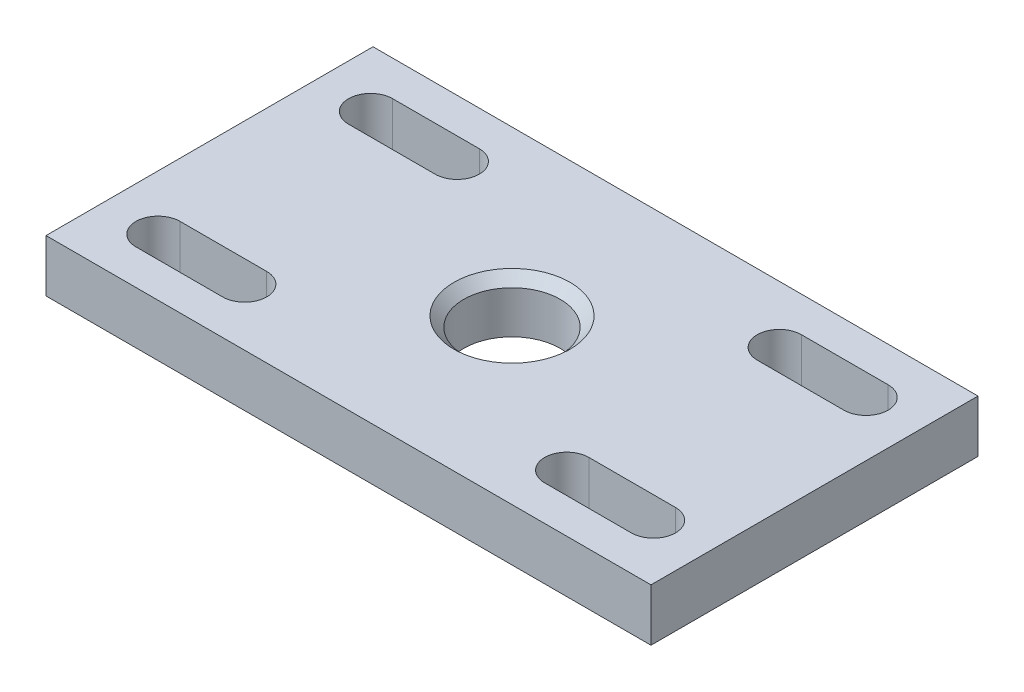
ISO-10303-21;
HEADER;
FILE_DESCRIPTION(('STEP AP214'),'2;1');
FILE_NAME('part.step','',(''),(''),'','','');
FILE_SCHEMA(('AUTOMOTIVE_DESIGN { 1 0 10303 214 1 1 1 1 }'));
ENDSEC;
DATA;
#1=APPLICATION_CONTEXT('core data for automotive mechanical design processes');
#2=APPLICATION_PROTOCOL_DEFINITION('international standard','automotive_design',2000,#1);
#3=PRODUCT_CONTEXT('',#1,'mechanical');
#4=PRODUCT('Part','Part','',(#3));
#5=PRODUCT_RELATED_PRODUCT_CATEGORY('part','',(#4));
#6=PRODUCT_DEFINITION_FORMATION('','',#4);
#7=PRODUCT_DEFINITION_CONTEXT('part definition',#1,'design');
#8=PRODUCT_DEFINITION('design','',#6,#7);
#9=PRODUCT_DEFINITION_SHAPE('','',#8);
#10=(LENGTH_UNIT() NAMED_UNIT(*) SI_UNIT(.MILLI.,.METRE.));
#11=(NAMED_UNIT(*) PLANE_ANGLE_UNIT() SI_UNIT($,.RADIAN.));
#12=(NAMED_UNIT(*) SI_UNIT($,.STERADIAN.) SOLID_ANGLE_UNIT());
#13=UNCERTAINTY_MEASURE_WITH_UNIT(LENGTH_MEASURE(1.E-05),#10,'distance_accuracy_value','');
#14=(GEOMETRIC_REPRESENTATION_CONTEXT(3) GLOBAL_UNCERTAINTY_ASSIGNED_CONTEXT((#13)) GLOBAL_UNIT_ASSIGNED_CONTEXT((#10,
#11,#12)) REPRESENTATION_CONTEXT('',''));
#15=CARTESIAN_POINT('',(0.,0.,0.));
#16=DIRECTION('',(0.,0.,1.));
#17=DIRECTION('',(1.,0.,0.));
#18=AXIS2_PLACEMENT_3D('',#15,#16,#17);
#19=CARTESIAN_POINT('',(92.5,16.,50.));
#20=DIRECTION('',(-1.,0.,0.));
#21=DIRECTION('',(0.,0.,1.));
#22=AXIS2_PLACEMENT_3D('',#19,#20,#21);
#23=PLANE('',#22);
#24=DIRECTION('',(0.,0.,-1.));
#25=VECTOR('',#24,1.);
#26=CARTESIAN_POINT('',(92.5,0.,50.));
#27=LINE('',#26,#25);
#28=CARTESIAN_POINT('',(92.5,0.,50.));
#29=VERTEX_POINT('',#28);
#30=CARTESIAN_POINT('',(92.5,0.,-50.));
#31=VERTEX_POINT('',#30);
#32=EDGE_CURVE('E195',#29,#31,#27,.T.);
#33=ORIENTED_EDGE('',*,*,#32,.T.);
#34=DIRECTION('',(0.,-1.,0.));
#35=VECTOR('',#34,1.);
#36=CARTESIAN_POINT('',(92.5,16.,-50.));
#37=LINE('',#36,#35);
#38=CARTESIAN_POINT('',(92.5,16.,-50.));
#39=VERTEX_POINT('',#38);
#40=EDGE_CURVE('E198',#39,#31,#37,.T.);
#41=ORIENTED_EDGE('',*,*,#40,.F.);
#42=DIRECTION('',(0.,0.,-1.));
#43=VECTOR('',#42,1.);
#44=CARTESIAN_POINT('',(92.5,16.,50.));
#45=LINE('',#44,#43);
#46=CARTESIAN_POINT('',(92.5,16.,50.));
#47=VERTEX_POINT('',#46);
#48=EDGE_CURVE('E358',#47,#39,#45,.T.);
#49=ORIENTED_EDGE('',*,*,#48,.F.);
#50=DIRECTION('',(0.,-1.,0.));
#51=VECTOR('',#50,1.);
#52=CARTESIAN_POINT('',(92.5,16.,50.));
#53=LINE('',#52,#51);
#54=EDGE_CURVE('E375',#47,#29,#53,.T.);
#55=ORIENTED_EDGE('',*,*,#54,.T.);
#56=EDGE_LOOP('',(#33,#41,#49,#55));
#57=FACE_BOUND('',#56,.T.);
#58=ADVANCED_FACE('F41',(#57),#23,.F.);
#59=CARTESIAN_POINT('',(-92.5,16.,-50.));
#60=DIRECTION('',(0.,0.,1.));
#61=DIRECTION('',(1.,0.,0.));
#62=AXIS2_PLACEMENT_3D('',#59,#60,#61);
#63=PLANE('',#62);
#64=DIRECTION('',(-1.,0.,0.));
#65=VECTOR('',#64,1.);
#66=CARTESIAN_POINT('',(-92.5,0.,-50.));
#67=LINE('',#66,#65);
#68=CARTESIAN_POINT('',(-92.5,0.,-50.));
#69=VERTEX_POINT('',#68);
#70=EDGE_CURVE('E96',#31,#69,#67,.T.);
#71=ORIENTED_EDGE('',*,*,#70,.T.);
#72=DIRECTION('',(0.,-1.,0.));
#73=VECTOR('',#72,1.);
#74=CARTESIAN_POINT('',(-92.5,16.,-50.));
#75=LINE('',#74,#73);
#76=CARTESIAN_POINT('',(-92.5,16.,-50.));
#77=VERTEX_POINT('',#76);
#78=EDGE_CURVE('E202',#77,#69,#75,.T.);
#79=ORIENTED_EDGE('',*,*,#78,.F.);
#80=DIRECTION('',(-1.,0.,0.));
#81=VECTOR('',#80,1.);
#82=CARTESIAN_POINT('',(-92.5,16.,-50.));
#83=LINE('',#82,#81);
#84=EDGE_CURVE('E362',#39,#77,#83,.T.);
#85=ORIENTED_EDGE('',*,*,#84,.F.);
#86=ORIENTED_EDGE('',*,*,#40,.T.);
#87=EDGE_LOOP('',(#71,#79,#85,#86));
#88=FACE_BOUND('',#87,.T.);
#89=ADVANCED_FACE('F462',(#88),#63,.F.);
#90=CARTESIAN_POINT('',(-92.5,16.,50.));
#91=DIRECTION('',(1.,0.,0.));
#92=DIRECTION('',(0.,0.,-1.));
#93=AXIS2_PLACEMENT_3D('',#90,#91,#92);
#94=PLANE('',#93);
#95=DIRECTION('',(0.,0.,1.));
#96=VECTOR('',#95,1.);
#97=CARTESIAN_POINT('',(-92.5,0.,50.));
#98=LINE('',#97,#96);
#99=CARTESIAN_POINT('',(-92.5,0.,50.));
#100=VERTEX_POINT('',#99);
#101=EDGE_CURVE('E380',#69,#100,#98,.T.);
#102=ORIENTED_EDGE('',*,*,#101,.T.);
#103=DIRECTION('',(0.,-1.,0.));
#104=VECTOR('',#103,1.);
#105=CARTESIAN_POINT('',(-92.5,16.,50.));
#106=LINE('',#105,#104);
#107=CARTESIAN_POINT('',(-92.5,16.,50.));
#108=VERTEX_POINT('',#107);
#109=EDGE_CURVE('E210',#108,#100,#106,.T.);
#110=ORIENTED_EDGE('',*,*,#109,.F.);
#111=DIRECTION('',(0.,0.,1.));
#112=VECTOR('',#111,1.);
#113=CARTESIAN_POINT('',(-92.5,16.,50.));
#114=LINE('',#113,#112);
#115=EDGE_CURVE('E367',#77,#108,#114,.T.);
#116=ORIENTED_EDGE('',*,*,#115,.F.);
#117=ORIENTED_EDGE('',*,*,#78,.T.);
#118=EDGE_LOOP('',(#102,#110,#116,#117));
#119=FACE_BOUND('',#118,.T.);
#120=ADVANCED_FACE('F466',(#119),#94,.F.);
#121=CARTESIAN_POINT('',(-92.5,16.,50.));
#122=DIRECTION('',(0.,0.,-1.));
#123=DIRECTION('',(-1.,0.,0.));
#124=AXIS2_PLACEMENT_3D('',#121,#122,#123);
#125=PLANE('',#124);
#126=DIRECTION('',(1.,0.,0.));
#127=VECTOR('',#126,1.);
#128=CARTESIAN_POINT('',(-92.5,0.,50.));
#129=LINE('',#128,#127);
#130=EDGE_CURVE('E363',#100,#29,#129,.T.);
#131=ORIENTED_EDGE('',*,*,#130,.T.);
#132=ORIENTED_EDGE('',*,*,#54,.F.);
#133=DIRECTION('',(1.,0.,0.));
#134=VECTOR('',#133,1.);
#135=CARTESIAN_POINT('',(-92.5,16.,50.));
#136=LINE('',#135,#134);
#137=EDGE_CURVE('E371',#108,#47,#136,.T.);
#138=ORIENTED_EDGE('',*,*,#137,.F.);
#139=ORIENTED_EDGE('',*,*,#109,.T.);
#140=EDGE_LOOP('',(#131,#132,#138,#139));
#141=FACE_BOUND('',#140,.T.);
#142=ADVANCED_FACE('F393',(#141),#125,.F.);
#143=CARTESIAN_POINT('',(0.,16.,0.));
#144=DIRECTION('',(0.,-1.,0.));
#145=DIRECTION('',(0.,0.,-1.));
#146=AXIS2_PLACEMENT_3D('',#143,#144,#145);
#147=PLANE('',#146);
#148=CARTESIAN_POINT('',(0.,16.,0.));
#149=DIRECTION('',(0.,-1.,0.));
#150=DIRECTION('',(0.,0.,-1.));
#151=AXIS2_PLACEMENT_3D('',#148,#149,#150);
#152=CIRCLE('',#151,17.7500000000001);
#153=CARTESIAN_POINT('',(0.,16.,-17.7500000000001));
#154=VERTEX_POINT('',#153);
#155=EDGE_CURVE('E11',#154,#154,#152,.T.);
#156=ORIENTED_EDGE('',*,*,#155,.T.);
#157=EDGE_LOOP('',(#156));
#158=FACE_BOUND('',#157,.T.);
#159=DIRECTION('',(-1.,0.,0.));
#160=VECTOR('',#159,1.);
#161=CARTESIAN_POINT('',(-49.25,16.,25.75));
#162=LINE('',#161,#160);
#163=CARTESIAN_POINT('',(-49.25,16.,25.75));
#164=VERTEX_POINT('',#163);
#165=CARTESIAN_POINT('',(-75.75,16.,25.75));
#166=VERTEX_POINT('',#165);
#167=EDGE_CURVE('E182',#164,#166,#162,.T.);
#168=ORIENTED_EDGE('',*,*,#167,.F.);
#169=CARTESIAN_POINT('',(-49.25,16.,32.5));
#170=DIRECTION('',(0.,1.,0.));
#171=DIRECTION('',(0.,0.,1.));
#172=AXIS2_PLACEMENT_3D('',#169,#170,#171);
#173=CIRCLE('',#172,6.75);
#174=CARTESIAN_POINT('',(-49.25,16.,39.25));
#175=VERTEX_POINT('',#174);
#176=EDGE_CURVE('E193',#175,#164,#173,.T.);
#177=ORIENTED_EDGE('',*,*,#176,.F.);
#178=DIRECTION('',(1.,0.,0.));
#179=VECTOR('',#178,1.);
#180=CARTESIAN_POINT('',(-49.25,16.,39.25));
#181=LINE('',#180,#179);
#182=CARTESIAN_POINT('',(-75.75,16.,39.25));
#183=VERTEX_POINT('',#182);
#184=EDGE_CURVE('E87',#183,#175,#181,.T.);
#185=ORIENTED_EDGE('',*,*,#184,.F.);
#186=CARTESIAN_POINT('',(-75.75,16.,32.5));
#187=DIRECTION('',(0.,1.,0.));
#188=DIRECTION('',(0.,0.,1.));
#189=AXIS2_PLACEMENT_3D('',#186,#187,#188);
#190=CIRCLE('',#189,6.75);
#191=EDGE_CURVE('E185',#166,#183,#190,.T.);
#192=ORIENTED_EDGE('',*,*,#191,.F.);
#193=EDGE_LOOP('',(#168,#177,#185,#192));
#194=FACE_BOUND('',#193,.T.);
#195=DIRECTION('',(1.,0.,0.));
#196=VECTOR('',#195,1.);
#197=CARTESIAN_POINT('',(49.25,16.,-25.75));
#198=LINE('',#197,#196);
#199=CARTESIAN_POINT('',(49.25,16.,-25.75));
#200=VERTEX_POINT('',#199);
#201=CARTESIAN_POINT('',(75.75,16.,-25.75));
#202=VERTEX_POINT('',#201);
#203=EDGE_CURVE('E180',#200,#202,#198,.T.);
#204=ORIENTED_EDGE('',*,*,#203,.F.);
#205=CARTESIAN_POINT('',(49.25,16.,-32.5));
#206=DIRECTION('',(0.,1.,0.));
#207=DIRECTION('',(0.,0.,1.));
#208=AXIS2_PLACEMENT_3D('',#205,#206,#207);
#209=CIRCLE('',#208,6.74999999999998);
#210=CARTESIAN_POINT('',(49.25,16.,-39.25));
#211=VERTEX_POINT('',#210);
#212=EDGE_CURVE('E167',#211,#200,#209,.T.);
#213=ORIENTED_EDGE('',*,*,#212,.F.);
#214=DIRECTION('',(-1.,0.,0.));
#215=VECTOR('',#214,1.);
#216=CARTESIAN_POINT('',(49.25,16.,-39.25));
#217=LINE('',#216,#215);
#218=CARTESIAN_POINT('',(75.75,16.,-39.25));
#219=VERTEX_POINT('',#218);
#220=EDGE_CURVE('E156',#219,#211,#217,.T.);
#221=ORIENTED_EDGE('',*,*,#220,.F.);
#222=CARTESIAN_POINT('',(75.75,16.,-32.5));
#223=DIRECTION('',(0.,1.,0.));
#224=DIRECTION('',(0.,0.,1.));
#225=AXIS2_PLACEMENT_3D('',#222,#223,#224);
#226=CIRCLE('',#225,6.74999999999998);
#227=EDGE_CURVE('E150',#202,#219,#226,.T.);
#228=ORIENTED_EDGE('',*,*,#227,.F.);
#229=EDGE_LOOP('',(#204,#213,#221,#228));
#230=FACE_BOUND('',#229,.T.);
#231=DIRECTION('',(1.,0.,0.));
#232=VECTOR('',#231,1.);
#233=CARTESIAN_POINT('',(49.25,16.,39.25));
#234=LINE('',#233,#232);
#235=CARTESIAN_POINT('',(49.25,16.,39.25));
#236=VERTEX_POINT('',#235);
#237=CARTESIAN_POINT('',(75.75,16.,39.25));
#238=VERTEX_POINT('',#237);
#239=EDGE_CURVE('E228',#236,#238,#234,.T.);
#240=ORIENTED_EDGE('',*,*,#239,.F.);
#241=CARTESIAN_POINT('',(49.25,16.,32.5));
#242=DIRECTION('',(0.,1.,0.));
#243=DIRECTION('',(0.,0.,1.));
#244=AXIS2_PLACEMENT_3D('',#241,#242,#243);
#245=CIRCLE('',#244,6.75);
#246=CARTESIAN_POINT('',(49.25,16.,25.75));
#247=VERTEX_POINT('',#246);
#248=EDGE_CURVE('E237',#247,#236,#245,.T.);
#249=ORIENTED_EDGE('',*,*,#248,.F.);
#250=DIRECTION('',(-1.,0.,0.));
#251=VECTOR('',#250,1.);
#252=CARTESIAN_POINT('',(49.25,16.,25.75));
#253=LINE('',#252,#251);
#254=CARTESIAN_POINT('',(75.75,16.,25.75));
#255=VERTEX_POINT('',#254);
#256=EDGE_CURVE('E234',#255,#247,#253,.T.);
#257=ORIENTED_EDGE('',*,*,#256,.F.);
#258=CARTESIAN_POINT('',(75.75,16.,32.5));
#259=DIRECTION('',(0.,1.,0.));
#260=DIRECTION('',(0.,0.,1.));
#261=AXIS2_PLACEMENT_3D('',#258,#259,#260);
#262=CIRCLE('',#261,6.75);
#263=EDGE_CURVE('E231',#238,#255,#262,.T.);
#264=ORIENTED_EDGE('',*,*,#263,.F.);
#265=EDGE_LOOP('',(#240,#249,#257,#264));
#266=FACE_BOUND('',#265,.T.);
#267=DIRECTION('',(1.,0.,0.));
#268=VECTOR('',#267,1.);
#269=CARTESIAN_POINT('',(-75.75,16.,-25.75));
#270=LINE('',#269,#268);
#271=CARTESIAN_POINT('',(-75.75,16.,-25.75));
#272=VERTEX_POINT('',#271);
#273=CARTESIAN_POINT('',(-49.25,16.,-25.75));
#274=VERTEX_POINT('',#273);
#275=EDGE_CURVE('E214',#272,#274,#270,.T.);
#276=ORIENTED_EDGE('',*,*,#275,.F.);
#277=CARTESIAN_POINT('',(-75.75,16.,-32.5));
#278=DIRECTION('',(0.,1.,0.));
#279=DIRECTION('',(0.,0.,1.));
#280=AXIS2_PLACEMENT_3D('',#277,#278,#279);
#281=CIRCLE('',#280,6.75000000000001);
#282=CARTESIAN_POINT('',(-75.75,16.,-39.25));
#283=VERTEX_POINT('',#282);
#284=EDGE_CURVE('E224',#283,#272,#281,.T.);
#285=ORIENTED_EDGE('',*,*,#284,.F.);
#286=DIRECTION('',(-1.,0.,0.));
#287=VECTOR('',#286,1.);
#288=CARTESIAN_POINT('',(-75.75,16.,-39.25));
#289=LINE('',#288,#287);
#290=CARTESIAN_POINT('',(-49.25,16.,-39.25));
#291=VERTEX_POINT('',#290);
#292=EDGE_CURVE('E221',#291,#283,#289,.T.);
#293=ORIENTED_EDGE('',*,*,#292,.F.);
#294=CARTESIAN_POINT('',(-49.25,16.,-32.5));
#295=DIRECTION('',(0.,1.,0.));
#296=DIRECTION('',(0.,0.,1.));
#297=AXIS2_PLACEMENT_3D('',#294,#295,#296);
#298=CIRCLE('',#297,6.75000000000001);
#299=EDGE_CURVE('E217',#274,#291,#298,.T.);
#300=ORIENTED_EDGE('',*,*,#299,.F.);
#301=EDGE_LOOP('',(#276,#285,#293,#300));
#302=FACE_BOUND('',#301,.T.);
#303=ORIENTED_EDGE('',*,*,#48,.T.);
#304=ORIENTED_EDGE('',*,*,#84,.T.);
#305=ORIENTED_EDGE('',*,*,#115,.T.);
#306=ORIENTED_EDGE('',*,*,#137,.T.);
#307=EDGE_LOOP('',(#303,#304,#305,#306));
#308=FACE_BOUND('',#307,.T.);
#309=ADVANCED_FACE('F178',(#158,#194,#230,#266,#302,#308),#147,.F.);
#310=CARTESIAN_POINT('',(0.,0.,0.));
#311=DIRECTION('',(0.,-1.,0.));
#312=DIRECTION('',(0.,0.,-1.));
#313=AXIS2_PLACEMENT_3D('',#310,#311,#312);
#314=PLANE('',#313);
#315=CARTESIAN_POINT('',(0.,0.,0.));
#316=DIRECTION('',(0.,-1.,0.));
#317=DIRECTION('',(0.,0.,-1.));
#318=AXIS2_PLACEMENT_3D('',#315,#316,#317);
#319=CIRCLE('',#318,14.75);
#320=CARTESIAN_POINT('',(0.,0.,-14.75));
#321=VERTEX_POINT('',#320);
#322=EDGE_CURVE('E351',#321,#321,#319,.T.);
#323=ORIENTED_EDGE('',*,*,#322,.F.);
#324=EDGE_LOOP('',(#323));
#325=FACE_BOUND('',#324,.T.);
#326=CARTESIAN_POINT('',(-49.25,0.,32.5));
#327=DIRECTION('',(0.,1.,0.));
#328=DIRECTION('',(0.,0.,1.));
#329=AXIS2_PLACEMENT_3D('',#326,#327,#328);
#330=CIRCLE('',#329,6.75);
#331=CARTESIAN_POINT('',(-49.25,0.,39.25));
#332=VERTEX_POINT('',#331);
#333=CARTESIAN_POINT('',(-49.25,0.,25.75));
#334=VERTEX_POINT('',#333);
#335=EDGE_CURVE('E176',#332,#334,#330,.T.);
#336=ORIENTED_EDGE('',*,*,#335,.T.);
#337=DIRECTION('',(-1.,0.,0.));
#338=VECTOR('',#337,1.);
#339=CARTESIAN_POINT('',(-49.25,0.,25.75));
#340=LINE('',#339,#338);
#341=CARTESIAN_POINT('',(-75.75,0.,25.75));
#342=VERTEX_POINT('',#341);
#343=EDGE_CURVE('E293',#334,#342,#340,.T.);
#344=ORIENTED_EDGE('',*,*,#343,.T.);
#345=CARTESIAN_POINT('',(-75.75,0.,32.5));
#346=DIRECTION('',(0.,1.,0.));
#347=DIRECTION('',(0.,0.,1.));
#348=AXIS2_PLACEMENT_3D('',#345,#346,#347);
#349=CIRCLE('',#348,6.75);
#350=CARTESIAN_POINT('',(-75.75,0.,39.25));
#351=VERTEX_POINT('',#350);
#352=EDGE_CURVE('E289',#342,#351,#349,.T.);
#353=ORIENTED_EDGE('',*,*,#352,.T.);
#354=DIRECTION('',(1.,0.,0.));
#355=VECTOR('',#354,1.);
#356=CARTESIAN_POINT('',(-49.25,0.,39.25));
#357=LINE('',#356,#355);
#358=EDGE_CURVE('E285',#351,#332,#357,.T.);
#359=ORIENTED_EDGE('',*,*,#358,.T.);
#360=EDGE_LOOP('',(#336,#344,#353,#359));
#361=FACE_BOUND('',#360,.T.);
#362=CARTESIAN_POINT('',(49.25,0.,-32.5));
#363=DIRECTION('',(0.,1.,0.));
#364=DIRECTION('',(0.,0.,1.));
#365=AXIS2_PLACEMENT_3D('',#362,#363,#364);
#366=CIRCLE('',#365,6.74999999999998);
#367=CARTESIAN_POINT('',(49.25,0.,-39.25));
#368=VERTEX_POINT('',#367);
#369=CARTESIAN_POINT('',(49.25,0.,-25.75));
#370=VERTEX_POINT('',#369);
#371=EDGE_CURVE('E173',#368,#370,#366,.T.);
#372=ORIENTED_EDGE('',*,*,#371,.T.);
#373=DIRECTION('',(1.,0.,0.));
#374=VECTOR('',#373,1.);
#375=CARTESIAN_POINT('',(49.25,0.,-25.75));
#376=LINE('',#375,#374);
#377=CARTESIAN_POINT('',(75.75,0.,-25.75));
#378=VERTEX_POINT('',#377);
#379=EDGE_CURVE('E314',#370,#378,#376,.T.);
#380=ORIENTED_EDGE('',*,*,#379,.T.);
#381=CARTESIAN_POINT('',(75.75,0.,-32.5));
#382=DIRECTION('',(0.,1.,0.));
#383=DIRECTION('',(0.,0.,1.));
#384=AXIS2_PLACEMENT_3D('',#381,#382,#383);
#385=CIRCLE('',#384,6.74999999999998);
#386=CARTESIAN_POINT('',(75.75,0.,-39.25));
#387=VERTEX_POINT('',#386);
#388=EDGE_CURVE('E310',#378,#387,#385,.T.);
#389=ORIENTED_EDGE('',*,*,#388,.T.);
#390=DIRECTION('',(-1.,0.,0.));
#391=VECTOR('',#390,1.);
#392=CARTESIAN_POINT('',(49.25,0.,-39.25));
#393=LINE('',#392,#391);
#394=EDGE_CURVE('E307',#387,#368,#393,.T.);
#395=ORIENTED_EDGE('',*,*,#394,.T.);
#396=EDGE_LOOP('',(#372,#380,#389,#395));
#397=FACE_BOUND('',#396,.T.);
#398=CARTESIAN_POINT('',(49.25,0.,32.5));
#399=DIRECTION('',(0.,1.,0.));
#400=DIRECTION('',(0.,0.,1.));
#401=AXIS2_PLACEMENT_3D('',#398,#399,#400);
#402=CIRCLE('',#401,6.75);
#403=CARTESIAN_POINT('',(49.25,0.,25.75));
#404=VERTEX_POINT('',#403);
#405=CARTESIAN_POINT('',(49.25,0.,39.25));
#406=VERTEX_POINT('',#405);
#407=EDGE_CURVE('E347',#404,#406,#402,.T.);
#408=ORIENTED_EDGE('',*,*,#407,.T.);
#409=DIRECTION('',(1.,0.,0.));
#410=VECTOR('',#409,1.);
#411=CARTESIAN_POINT('',(49.25,0.,39.25));
#412=LINE('',#411,#410);
#413=CARTESIAN_POINT('',(75.75,0.,39.25));
#414=VERTEX_POINT('',#413);
#415=EDGE_CURVE('E343',#406,#414,#412,.T.);
#416=ORIENTED_EDGE('',*,*,#415,.T.);
#417=CARTESIAN_POINT('',(75.75,0.,32.5));
#418=DIRECTION('',(0.,1.,0.));
#419=DIRECTION('',(0.,0.,1.));
#420=AXIS2_PLACEMENT_3D('',#417,#418,#419);
#421=CIRCLE('',#420,6.75);
#422=CARTESIAN_POINT('',(75.75,0.,25.75));
#423=VERTEX_POINT('',#422);
#424=EDGE_CURVE('E339',#414,#423,#421,.T.);
#425=ORIENTED_EDGE('',*,*,#424,.T.);
#426=DIRECTION('',(-1.,0.,0.));
#427=VECTOR('',#426,1.);
#428=CARTESIAN_POINT('',(49.25,0.,25.75));
#429=LINE('',#428,#427);
#430=EDGE_CURVE('E335',#423,#404,#429,.T.);
#431=ORIENTED_EDGE('',*,*,#430,.T.);
#432=EDGE_LOOP('',(#408,#416,#425,#431));
#433=FACE_BOUND('',#432,.T.);
#434=CARTESIAN_POINT('',(-75.75,0.,-32.5));
#435=DIRECTION('',(0.,1.,0.));
#436=DIRECTION('',(0.,0.,1.));
#437=AXIS2_PLACEMENT_3D('',#434,#435,#436);
#438=CIRCLE('',#437,6.75000000000001);
#439=CARTESIAN_POINT('',(-75.75,0.,-39.25));
#440=VERTEX_POINT('',#439);
#441=CARTESIAN_POINT('',(-75.75,0.,-25.75));
#442=VERTEX_POINT('',#441);
#443=EDGE_CURVE('E269',#440,#442,#438,.T.);
#444=ORIENTED_EDGE('',*,*,#443,.T.);
#445=DIRECTION('',(1.,0.,0.));
#446=VECTOR('',#445,1.);
#447=CARTESIAN_POINT('',(-75.75,0.,-25.75));
#448=LINE('',#447,#446);
#449=CARTESIAN_POINT('',(-49.25,0.,-25.75));
#450=VERTEX_POINT('',#449);
#451=EDGE_CURVE('E265',#442,#450,#448,.T.);
#452=ORIENTED_EDGE('',*,*,#451,.T.);
#453=CARTESIAN_POINT('',(-49.25,0.,-32.5));
#454=DIRECTION('',(0.,1.,0.));
#455=DIRECTION('',(0.,0.,1.));
#456=AXIS2_PLACEMENT_3D('',#453,#454,#455);
#457=CIRCLE('',#456,6.75000000000001);
#458=CARTESIAN_POINT('',(-49.25,0.,-39.25));
#459=VERTEX_POINT('',#458);
#460=EDGE_CURVE('E261',#450,#459,#457,.T.);
#461=ORIENTED_EDGE('',*,*,#460,.T.);
#462=DIRECTION('',(-1.,0.,0.));
#463=VECTOR('',#462,1.);
#464=CARTESIAN_POINT('',(-75.75,0.,-39.25));
#465=LINE('',#464,#463);
#466=EDGE_CURVE('E257',#459,#440,#465,.T.);
#467=ORIENTED_EDGE('',*,*,#466,.T.);
#468=EDGE_LOOP('',(#444,#452,#461,#467));
#469=FACE_BOUND('',#468,.T.);
#470=ORIENTED_EDGE('',*,*,#32,.F.);
#471=ORIENTED_EDGE('',*,*,#130,.F.);
#472=ORIENTED_EDGE('',*,*,#101,.F.);
#473=ORIENTED_EDGE('',*,*,#70,.F.);
#474=EDGE_LOOP('',(#470,#471,#472,#473));
#475=FACE_BOUND('',#474,.T.);
#476=ADVANCED_FACE('F398',(#325,#361,#397,#433,#469,#475),#314,.T.);
#477=CARTESIAN_POINT('',(-75.75,0.,-32.5));
#478=DIRECTION('',(0.,1.,0.));
#479=DIRECTION('',(0.,0.,1.));
#480=AXIS2_PLACEMENT_3D('',#477,#478,#479);
#481=CYLINDRICAL_SURFACE('',#480,6.75000000000001);
#482=DIRECTION('',(0.,1.,0.));
#483=VECTOR('',#482,1.);
#484=CARTESIAN_POINT('',(-75.75,0.,-25.75));
#485=LINE('',#484,#483);
#486=EDGE_CURVE('E254',#442,#272,#485,.T.);
#487=ORIENTED_EDGE('',*,*,#486,.F.);
#488=ORIENTED_EDGE('',*,*,#443,.F.);
#489=DIRECTION('',(0.,1.,0.));
#490=VECTOR('',#489,1.);
#491=CARTESIAN_POINT('',(-75.75,0.,-39.25));
#492=LINE('',#491,#490);
#493=EDGE_CURVE('E218',#440,#283,#492,.T.);
#494=ORIENTED_EDGE('',*,*,#493,.T.);
#495=ORIENTED_EDGE('',*,*,#284,.T.);
#496=EDGE_LOOP('',(#487,#488,#494,#495));
#497=FACE_BOUND('',#496,.T.);
#498=ADVANCED_FACE('F475',(#497),#481,.F.);
#499=CARTESIAN_POINT('',(-75.75,0.,-39.25));
#500=DIRECTION('',(0.,0.,-1.));
#501=DIRECTION('',(-1.,0.,0.));
#502=AXIS2_PLACEMENT_3D('',#499,#500,#501);
#503=PLANE('',#502);
#504=ORIENTED_EDGE('',*,*,#493,.F.);
#505=ORIENTED_EDGE('',*,*,#466,.F.);
#506=DIRECTION('',(0.,1.,0.));
#507=VECTOR('',#506,1.);
#508=CARTESIAN_POINT('',(-49.25,0.,-39.25));
#509=LINE('',#508,#507);
#510=EDGE_CURVE('E246',#459,#291,#509,.T.);
#511=ORIENTED_EDGE('',*,*,#510,.T.);
#512=ORIENTED_EDGE('',*,*,#292,.T.);
#513=EDGE_LOOP('',(#504,#505,#511,#512));
#514=FACE_BOUND('',#513,.T.);
#515=ADVANCED_FACE('F482',(#514),#503,.F.);
#516=CARTESIAN_POINT('',(-49.25,0.,-32.5));
#517=DIRECTION('',(0.,1.,0.));
#518=DIRECTION('',(0.,0.,1.));
#519=AXIS2_PLACEMENT_3D('',#516,#517,#518);
#520=CYLINDRICAL_SURFACE('',#519,6.75000000000001);
#521=ORIENTED_EDGE('',*,*,#510,.F.);
#522=ORIENTED_EDGE('',*,*,#460,.F.);
#523=DIRECTION('',(0.,1.,0.));
#524=VECTOR('',#523,1.);
#525=CARTESIAN_POINT('',(-49.25,0.,-25.75));
#526=LINE('',#525,#524);
#527=EDGE_CURVE('E250',#450,#274,#526,.T.);
#528=ORIENTED_EDGE('',*,*,#527,.T.);
#529=ORIENTED_EDGE('',*,*,#299,.T.);
#530=EDGE_LOOP('',(#521,#522,#528,#529));
#531=FACE_BOUND('',#530,.T.);
#532=ADVANCED_FACE('F487',(#531),#520,.F.);
#533=CARTESIAN_POINT('',(-75.75,0.,-25.75));
#534=DIRECTION('',(0.,0.,1.));
#535=DIRECTION('',(1.,0.,0.));
#536=AXIS2_PLACEMENT_3D('',#533,#534,#535);
#537=PLANE('',#536);
#538=ORIENTED_EDGE('',*,*,#527,.F.);
#539=ORIENTED_EDGE('',*,*,#451,.F.);
#540=ORIENTED_EDGE('',*,*,#486,.T.);
#541=ORIENTED_EDGE('',*,*,#275,.T.);
#542=EDGE_LOOP('',(#538,#539,#540,#541));
#543=FACE_BOUND('',#542,.T.);
#544=ADVANCED_FACE('F484',(#543),#537,.F.);
#545=CARTESIAN_POINT('',(49.25,0.,32.5));
#546=DIRECTION('',(0.,1.,0.));
#547=DIRECTION('',(0.,0.,1.));
#548=AXIS2_PLACEMENT_3D('',#545,#546,#547);
#549=CYLINDRICAL_SURFACE('',#548,6.75);
#550=DIRECTION('',(0.,1.,0.));
#551=VECTOR('',#550,1.);
#552=CARTESIAN_POINT('',(49.25,0.,39.25));
#553=LINE('',#552,#551);
#554=EDGE_CURVE('E332',#406,#236,#553,.T.);
#555=ORIENTED_EDGE('',*,*,#554,.F.);
#556=ORIENTED_EDGE('',*,*,#407,.F.);
#557=DIRECTION('',(0.,1.,0.));
#558=VECTOR('',#557,1.);
#559=CARTESIAN_POINT('',(49.25,0.,25.75));
#560=LINE('',#559,#558);
#561=EDGE_CURVE('E320',#404,#247,#560,.T.);
#562=ORIENTED_EDGE('',*,*,#561,.T.);
#563=ORIENTED_EDGE('',*,*,#248,.T.);
#564=EDGE_LOOP('',(#555,#556,#562,#563));
#565=FACE_BOUND('',#564,.T.);
#566=ADVANCED_FACE('F437',(#565),#549,.F.);
#567=CARTESIAN_POINT('',(49.25,0.,25.75));
#568=DIRECTION('',(0.,0.,-1.));
#569=DIRECTION('',(-1.,0.,0.));
#570=AXIS2_PLACEMENT_3D('',#567,#568,#569);
#571=PLANE('',#570);
#572=ORIENTED_EDGE('',*,*,#561,.F.);
#573=ORIENTED_EDGE('',*,*,#430,.F.);
#574=DIRECTION('',(0.,1.,0.));
#575=VECTOR('',#574,1.);
#576=CARTESIAN_POINT('',(75.75,0.,25.75));
#577=LINE('',#576,#575);
#578=EDGE_CURVE('E324',#423,#255,#577,.T.);
#579=ORIENTED_EDGE('',*,*,#578,.T.);
#580=ORIENTED_EDGE('',*,*,#256,.T.);
#581=EDGE_LOOP('',(#572,#573,#579,#580));
#582=FACE_BOUND('',#581,.T.);
#583=ADVANCED_FACE('F447',(#582),#571,.F.);
#584=CARTESIAN_POINT('',(75.75,0.,32.5));
#585=DIRECTION('',(0.,1.,0.));
#586=DIRECTION('',(0.,0.,1.));
#587=AXIS2_PLACEMENT_3D('',#584,#585,#586);
#588=CYLINDRICAL_SURFACE('',#587,6.75);
#589=ORIENTED_EDGE('',*,*,#578,.F.);
#590=ORIENTED_EDGE('',*,*,#424,.F.);
#591=DIRECTION('',(0.,1.,0.));
#592=VECTOR('',#591,1.);
#593=CARTESIAN_POINT('',(75.75,0.,39.25));
#594=LINE('',#593,#592);
#595=EDGE_CURVE('E328',#414,#238,#594,.T.);
#596=ORIENTED_EDGE('',*,*,#595,.T.);
#597=ORIENTED_EDGE('',*,*,#263,.T.);
#598=EDGE_LOOP('',(#589,#590,#596,#597));
#599=FACE_BOUND('',#598,.T.);
#600=ADVANCED_FACE('F452',(#599),#588,.F.);
#601=CARTESIAN_POINT('',(49.25,0.,39.25));
#602=DIRECTION('',(0.,0.,1.));
#603=DIRECTION('',(1.,0.,0.));
#604=AXIS2_PLACEMENT_3D('',#601,#602,#603);
#605=PLANE('',#604);
#606=ORIENTED_EDGE('',*,*,#595,.F.);
#607=ORIENTED_EDGE('',*,*,#415,.F.);
#608=ORIENTED_EDGE('',*,*,#554,.T.);
#609=ORIENTED_EDGE('',*,*,#239,.T.);
#610=EDGE_LOOP('',(#606,#607,#608,#609));
#611=FACE_BOUND('',#610,.T.);
#612=ADVANCED_FACE('F442',(#611),#605,.F.);
#613=CARTESIAN_POINT('',(49.25,0.,-32.5));
#614=DIRECTION('',(0.,1.,0.));
#615=DIRECTION('',(0.,0.,1.));
#616=AXIS2_PLACEMENT_3D('',#613,#614,#615);
#617=CYLINDRICAL_SURFACE('',#616,6.74999999999998);
#618=DIRECTION('',(0.,1.,0.));
#619=VECTOR('',#618,1.);
#620=CARTESIAN_POINT('',(49.25,0.,-25.75));
#621=LINE('',#620,#619);
#622=EDGE_CURVE('E67',#370,#200,#621,.T.);
#623=ORIENTED_EDGE('',*,*,#622,.F.);
#624=ORIENTED_EDGE('',*,*,#371,.F.);
#625=DIRECTION('',(0.,1.,0.));
#626=VECTOR('',#625,1.);
#627=CARTESIAN_POINT('',(49.25,0.,-39.25));
#628=LINE('',#627,#626);
#629=EDGE_CURVE('E161',#368,#211,#628,.T.);
#630=ORIENTED_EDGE('',*,*,#629,.T.);
#631=ORIENTED_EDGE('',*,*,#212,.T.);
#632=EDGE_LOOP('',(#623,#624,#630,#631));
#633=FACE_BOUND('',#632,.T.);
#634=ADVANCED_FACE('F170',(#633),#617,.F.);
#635=CARTESIAN_POINT('',(49.25,0.,-39.25));
#636=DIRECTION('',(0.,0.,-1.));
#637=DIRECTION('',(-1.,0.,0.));
#638=AXIS2_PLACEMENT_3D('',#635,#636,#637);
#639=PLANE('',#638);
#640=ORIENTED_EDGE('',*,*,#629,.F.);
#641=ORIENTED_EDGE('',*,*,#394,.F.);
#642=DIRECTION('',(0.,1.,0.));
#643=VECTOR('',#642,1.);
#644=CARTESIAN_POINT('',(75.75,0.,-39.25));
#645=LINE('',#644,#643);
#646=EDGE_CURVE('E163',#387,#219,#645,.T.);
#647=ORIENTED_EDGE('',*,*,#646,.T.);
#648=ORIENTED_EDGE('',*,*,#220,.T.);
#649=EDGE_LOOP('',(#640,#641,#647,#648));
#650=FACE_BOUND('',#649,.T.);
#651=ADVANCED_FACE('F158',(#650),#639,.F.);
#652=CARTESIAN_POINT('',(75.75,0.,-32.5));
#653=DIRECTION('',(0.,1.,0.));
#654=DIRECTION('',(0.,0.,1.));
#655=AXIS2_PLACEMENT_3D('',#652,#653,#654);
#656=CYLINDRICAL_SURFACE('',#655,6.74999999999998);
#657=ORIENTED_EDGE('',*,*,#646,.F.);
#658=ORIENTED_EDGE('',*,*,#388,.F.);
#659=DIRECTION('',(0.,1.,0.));
#660=VECTOR('',#659,1.);
#661=CARTESIAN_POINT('',(75.75,0.,-25.75));
#662=LINE('',#661,#660);
#663=EDGE_CURVE('E302',#378,#202,#662,.T.);
#664=ORIENTED_EDGE('',*,*,#663,.T.);
#665=ORIENTED_EDGE('',*,*,#227,.T.);
#666=EDGE_LOOP('',(#657,#658,#664,#665));
#667=FACE_BOUND('',#666,.T.);
#668=ADVANCED_FACE('F501',(#667),#656,.F.);
#669=CARTESIAN_POINT('',(49.25,0.,-25.75));
#670=DIRECTION('',(0.,0.,1.));
#671=DIRECTION('',(1.,0.,0.));
#672=AXIS2_PLACEMENT_3D('',#669,#670,#671);
#673=PLANE('',#672);
#674=ORIENTED_EDGE('',*,*,#663,.F.);
#675=ORIENTED_EDGE('',*,*,#379,.F.);
#676=ORIENTED_EDGE('',*,*,#622,.T.);
#677=ORIENTED_EDGE('',*,*,#203,.T.);
#678=EDGE_LOOP('',(#674,#675,#676,#677));
#679=FACE_BOUND('',#678,.T.);
#680=ADVANCED_FACE('F497',(#679),#673,.F.);
#681=CARTESIAN_POINT('',(-49.25,0.,32.5));
#682=DIRECTION('',(0.,1.,0.));
#683=DIRECTION('',(0.,0.,1.));
#684=AXIS2_PLACEMENT_3D('',#681,#682,#683);
#685=CYLINDRICAL_SURFACE('',#684,6.75);
#686=DIRECTION('',(0.,1.,0.));
#687=VECTOR('',#686,1.);
#688=CARTESIAN_POINT('',(-49.25,0.,25.75));
#689=LINE('',#688,#687);
#690=EDGE_CURVE('E58',#334,#164,#689,.T.);
#691=ORIENTED_EDGE('',*,*,#690,.F.);
#692=ORIENTED_EDGE('',*,*,#335,.F.);
#693=DIRECTION('',(0.,1.,0.));
#694=VECTOR('',#693,1.);
#695=CARTESIAN_POINT('',(-49.25,0.,39.25));
#696=LINE('',#695,#694);
#697=EDGE_CURVE('E273',#332,#175,#696,.T.);
#698=ORIENTED_EDGE('',*,*,#697,.T.);
#699=ORIENTED_EDGE('',*,*,#176,.T.);
#700=EDGE_LOOP('',(#691,#692,#698,#699));
#701=FACE_BOUND('',#700,.T.);
#702=ADVANCED_FACE('F500',(#701),#685,.F.);
#703=CARTESIAN_POINT('',(-49.25,0.,39.25));
#704=DIRECTION('',(0.,0.,1.));
#705=DIRECTION('',(1.,0.,0.));
#706=AXIS2_PLACEMENT_3D('',#703,#704,#705);
#707=PLANE('',#706);
#708=ORIENTED_EDGE('',*,*,#697,.F.);
#709=ORIENTED_EDGE('',*,*,#358,.F.);
#710=DIRECTION('',(0.,1.,0.));
#711=VECTOR('',#710,1.);
#712=CARTESIAN_POINT('',(-75.75,0.,39.25));
#713=LINE('',#712,#711);
#714=EDGE_CURVE('E276',#351,#183,#713,.T.);
#715=ORIENTED_EDGE('',*,*,#714,.T.);
#716=ORIENTED_EDGE('',*,*,#184,.T.);
#717=EDGE_LOOP('',(#708,#709,#715,#716));
#718=FACE_BOUND('',#717,.T.);
#719=ADVANCED_FACE('F508',(#718),#707,.F.);
#720=CARTESIAN_POINT('',(-75.75,0.,32.5));
#721=DIRECTION('',(0.,1.,0.));
#722=DIRECTION('',(0.,0.,1.));
#723=AXIS2_PLACEMENT_3D('',#720,#721,#722);
#724=CYLINDRICAL_SURFACE('',#723,6.75);
#725=ORIENTED_EDGE('',*,*,#714,.F.);
#726=ORIENTED_EDGE('',*,*,#352,.F.);
#727=DIRECTION('',(0.,1.,0.));
#728=VECTOR('',#727,1.);
#729=CARTESIAN_POINT('',(-75.75,0.,25.75));
#730=LINE('',#729,#728);
#731=EDGE_CURVE('E279',#342,#166,#730,.T.);
#732=ORIENTED_EDGE('',*,*,#731,.T.);
#733=ORIENTED_EDGE('',*,*,#191,.T.);
#734=EDGE_LOOP('',(#725,#726,#732,#733));
#735=FACE_BOUND('',#734,.T.);
#736=ADVANCED_FACE('F514',(#735),#724,.F.);
#737=CARTESIAN_POINT('',(-49.25,0.,25.75));
#738=DIRECTION('',(0.,0.,-1.));
#739=DIRECTION('',(-1.,0.,0.));
#740=AXIS2_PLACEMENT_3D('',#737,#738,#739);
#741=PLANE('',#740);
#742=ORIENTED_EDGE('',*,*,#731,.F.);
#743=ORIENTED_EDGE('',*,*,#343,.F.);
#744=ORIENTED_EDGE('',*,*,#690,.T.);
#745=ORIENTED_EDGE('',*,*,#167,.T.);
#746=EDGE_LOOP('',(#742,#743,#744,#745));
#747=FACE_BOUND('',#746,.T.);
#748=ADVANCED_FACE('F510',(#747),#741,.F.);
#749=CARTESIAN_POINT('',(0.,16.,0.));
#750=DIRECTION('',(0.,1.,0.));
#751=DIRECTION('',(0.,0.,1.));
#752=AXIS2_PLACEMENT_3D('',#749,#750,#751);
#753=CYLINDRICAL_SURFACE('',#752,14.75);
#754=CARTESIAN_POINT('',(0.,13.,0.));
#755=DIRECTION('',(0.,-1.,0.));
#756=DIRECTION('',(0.,0.,-1.));
#757=AXIS2_PLACEMENT_3D('',#754,#755,#756);
#758=CIRCLE('',#757,14.75);
#759=CARTESIAN_POINT('',(0.,13.,-14.75));
#760=VERTEX_POINT('',#759);
#761=EDGE_CURVE('E51',#760,#760,#758,.F.);
#762=ORIENTED_EDGE('',*,*,#761,.T.);
#763=EDGE_LOOP('',(#762));
#764=FACE_BOUND('',#763,.T.);
#765=ORIENTED_EDGE('',*,*,#322,.T.);
#766=EDGE_LOOP('',(#765));
#767=FACE_BOUND('',#766,.T.);
#768=ADVANCED_FACE('F513',(#764,#767),#753,.F.);
#769=CARTESIAN_POINT('',(0.,13.,0.));
#770=DIRECTION('',(0.,1.,0.));
#771=DIRECTION('',(0.,0.,1.));
#772=AXIS2_PLACEMENT_3D('',#769,#770,#771);
#773=CONICAL_SURFACE('',#772,14.75,0.785398163397453);
#774=ORIENTED_EDGE('',*,*,#155,.F.);
#775=EDGE_LOOP('',(#774));
#776=FACE_BOUND('',#775,.T.);
#777=ORIENTED_EDGE('',*,*,#761,.F.);
#778=EDGE_LOOP('',(#777));
#779=FACE_BOUND('',#778,.T.);
#780=ADVANCED_FACE('F44',(#776,#779),#773,.F.);
#781=CLOSED_SHELL('',(#58,#89,#120,#142,#309,#476,#498,#515,#532,#544,#566,#583,#600,#612,#634,
#651,#668,#680,#702,#719,#736,#748,#768,#780));
#782=MANIFOLD_SOLID_BREP('B2',#781);
#783=ADVANCED_BREP_SHAPE_REPRESENTATION('',(#18,#782),#14);
#784=SHAPE_DEFINITION_REPRESENTATION(#9,#783);
ENDSEC;
END-ISO-10303-21;
